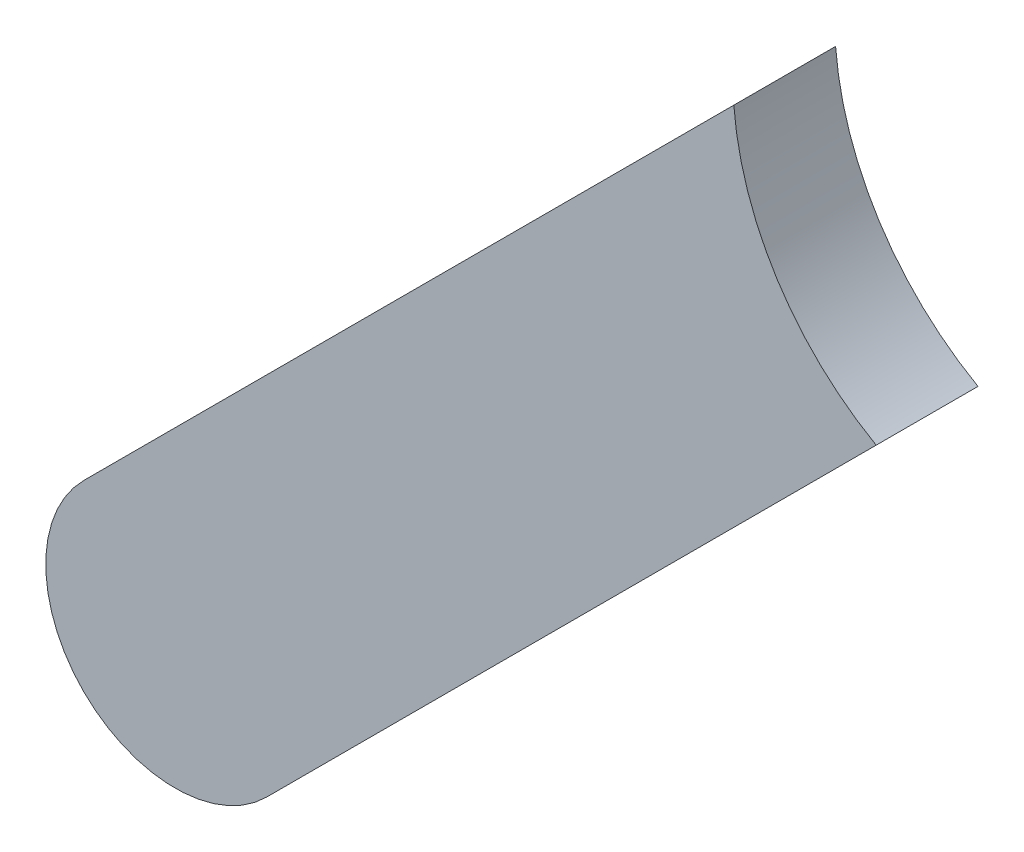
ISO-10303-21;
HEADER;
FILE_DESCRIPTION(('STEP AP214'),'2;1');
FILE_NAME('part.step','',(''),(''),'','','');
FILE_SCHEMA(('AUTOMOTIVE_DESIGN { 1 0 10303 214 1 1 1 1 }'));
ENDSEC;
DATA;
#1=APPLICATION_CONTEXT('core data for automotive mechanical design processes');
#2=APPLICATION_PROTOCOL_DEFINITION('international standard','automotive_design',2000,#1);
#3=PRODUCT_CONTEXT('',#1,'mechanical');
#4=PRODUCT('Part','Part','',(#3));
#5=PRODUCT_RELATED_PRODUCT_CATEGORY('part','',(#4));
#6=PRODUCT_DEFINITION_FORMATION('','',#4);
#7=PRODUCT_DEFINITION_CONTEXT('part definition',#1,'design');
#8=PRODUCT_DEFINITION('design','',#6,#7);
#9=PRODUCT_DEFINITION_SHAPE('','',#8);
#10=(LENGTH_UNIT() NAMED_UNIT(*) SI_UNIT(.MILLI.,.METRE.));
#11=(NAMED_UNIT(*) PLANE_ANGLE_UNIT() SI_UNIT($,.RADIAN.));
#12=(NAMED_UNIT(*) SI_UNIT($,.STERADIAN.) SOLID_ANGLE_UNIT());
#13=UNCERTAINTY_MEASURE_WITH_UNIT(LENGTH_MEASURE(1.E-05),#10,'distance_accuracy_value','');
#14=(GEOMETRIC_REPRESENTATION_CONTEXT(3) GLOBAL_UNCERTAINTY_ASSIGNED_CONTEXT((#13)) GLOBAL_UNIT_ASSIGNED_CONTEXT((#10,
#11,#12)) REPRESENTATION_CONTEXT('',''));
#15=CARTESIAN_POINT('',(0.,0.,0.));
#16=DIRECTION('',(0.,0.,1.));
#17=DIRECTION('',(1.,0.,0.));
#18=AXIS2_PLACEMENT_3D('',#15,#16,#17);
#19=CARTESIAN_POINT('',(147.4996034,71.46810446,0.));
#20=DIRECTION('',(-0.707106781186551,0.707106781186544,0.));
#21=DIRECTION('',(0.707106781186544,0.707106781186551,0.));
#22=AXIS2_PLACEMENT_3D('',#19,#20,#21);
#23=PLANE('',#22);
#24=DIRECTION('',(0.707106781186544,0.707106781186551,0.));
#25=VECTOR('',#24,1.);
#26=CARTESIAN_POINT('',(147.4996034,71.46810446,0.1999996));
#27=LINE('',#26,#25);
#28=CARTESIAN_POINT('',(147.4996034,71.46810446,0.1999996));
#29=VERTEX_POINT('',#28);
#30=CARTESIAN_POINT('',(148.697544783277,72.6660458432771,0.1999996));
#31=VERTEX_POINT('',#30);
#32=EDGE_CURVE('E11',#29,#31,#27,.T.);
#33=ORIENTED_EDGE('',*,*,#32,.F.);
#34=DIRECTION('',(0.,0.,1.));
#35=VECTOR('',#34,1.);
#36=CARTESIAN_POINT('',(147.4996034,71.46810446,0.));
#37=LINE('',#36,#35);
#38=CARTESIAN_POINT('',(147.4996034,71.46810446,0.));
#39=VERTEX_POINT('',#38);
#40=EDGE_CURVE('E24',#39,#29,#37,.T.);
#41=ORIENTED_EDGE('',*,*,#40,.F.);
#42=DIRECTION('',(0.707106781186544,0.707106781186551,0.));
#43=VECTOR('',#42,1.);
#44=CARTESIAN_POINT('',(147.4996034,71.46810446,0.));
#45=LINE('',#44,#43);
#46=CARTESIAN_POINT('',(148.697544783277,72.6660458432771,0.));
#47=VERTEX_POINT('',#46);
#48=EDGE_CURVE('E75',#39,#47,#45,.T.);
#49=ORIENTED_EDGE('',*,*,#48,.T.);
#50=DIRECTION('',(0.,0.,1.));
#51=VECTOR('',#50,1.);
#52=CARTESIAN_POINT('',(148.697544783277,72.6660458432771,0.));
#53=LINE('',#52,#51);
#54=EDGE_CURVE('E37',#47,#31,#53,.T.);
#55=ORIENTED_EDGE('',*,*,#54,.T.);
#56=EDGE_LOOP('',(#33,#41,#49,#55));
#57=FACE_BOUND('',#56,.T.);
#58=ADVANCED_FACE('F17',(#57),#23,.F.);
#59=CARTESIAN_POINT('',(148.971,73.1490028,0.));
#60=DIRECTION('',(0.,0.,-1.));
#61=DIRECTION('',(1.,0.,0.));
#62=AXIS2_PLACEMENT_3D('',#59,#60,#61);
#63=CYLINDRICAL_SURFACE('',#62,0.55500016);
#64=DIRECTION('',(0.,0.,1.));
#65=VECTOR('',#64,1.);
#66=CARTESIAN_POINT('',(148.417771592012,73.1046913320121,0.));
#67=LINE('',#66,#65);
#68=CARTESIAN_POINT('',(148.417771592012,73.1046913320121,0.));
#69=VERTEX_POINT('',#68);
#70=CARTESIAN_POINT('',(148.417771592012,73.1046913320121,0.1999996));
#71=VERTEX_POINT('',#70);
#72=EDGE_CURVE('E67',#69,#71,#67,.T.);
#73=ORIENTED_EDGE('',*,*,#72,.T.);
#74=CARTESIAN_POINT('',(148.971,73.1490028,0.1999996));
#75=DIRECTION('',(0.,0.,1.));
#76=DIRECTION('',(1.,0.,0.));
#77=AXIS2_PLACEMENT_3D('',#74,#75,#76);
#78=CIRCLE('',#77,0.55500016);
#79=EDGE_CURVE('E82',#71,#31,#78,.T.);
#80=ORIENTED_EDGE('',*,*,#79,.T.);
#81=ORIENTED_EDGE('',*,*,#54,.F.);
#82=CARTESIAN_POINT('',(148.971,73.1490028,0.));
#83=DIRECTION('',(0.,0.,1.));
#84=DIRECTION('',(1.,0.,0.));
#85=AXIS2_PLACEMENT_3D('',#82,#83,#84);
#86=CIRCLE('',#85,0.55500016);
#87=EDGE_CURVE('E80',#69,#47,#86,.T.);
#88=ORIENTED_EDGE('',*,*,#87,.F.);
#89=EDGE_LOOP('',(#73,#80,#81,#88));
#90=FACE_BOUND('',#89,.T.);
#91=ADVANCED_FACE('F88',(#90),#63,.F.);
#92=CARTESIAN_POINT('',(148.417771592012,73.1046913320121,0.));
#93=DIRECTION('',(0.707106781186544,-0.707106781186551,0.));
#94=DIRECTION('',(-0.707106781186551,-0.707106781186544,0.));
#95=AXIS2_PLACEMENT_3D('',#92,#93,#94);
#96=PLANE('',#95);
#97=DIRECTION('',(-0.707106781186551,-0.707106781186544,0.));
#98=VECTOR('',#97,1.);
#99=CARTESIAN_POINT('',(148.641689,73.32860874,0.1999996));
#100=LINE('',#99,#98);
#101=CARTESIAN_POINT('',(147.14039406,71.8273138,0.1999996));
#102=VERTEX_POINT('',#101);
#103=EDGE_CURVE('E71',#71,#102,#100,.T.);
#104=ORIENTED_EDGE('',*,*,#103,.F.);
#105=ORIENTED_EDGE('',*,*,#72,.F.);
#106=DIRECTION('',(-0.707106781186551,-0.707106781186544,0.));
#107=VECTOR('',#106,1.);
#108=CARTESIAN_POINT('',(148.641689,73.32860874,0.));
#109=LINE('',#108,#107);
#110=CARTESIAN_POINT('',(147.14039406,71.8273138,0.));
#111=VERTEX_POINT('',#110);
#112=EDGE_CURVE('E63',#69,#111,#109,.T.);
#113=ORIENTED_EDGE('',*,*,#112,.T.);
#114=DIRECTION('',(0.,0.,1.));
#115=VECTOR('',#114,1.);
#116=CARTESIAN_POINT('',(147.14039406,71.8273138,0.));
#117=LINE('',#116,#115);
#118=EDGE_CURVE('E53',#111,#102,#117,.T.);
#119=ORIENTED_EDGE('',*,*,#118,.T.);
#120=EDGE_LOOP('',(#104,#105,#113,#119));
#121=FACE_BOUND('',#120,.T.);
#122=ADVANCED_FACE('F66',(#121),#96,.F.);
#123=CARTESIAN_POINT('',(147.31999873,71.64770913,0.));
#124=DIRECTION('',(0.,0.,-1.));
#125=DIRECTION('',(-0.707106781186632,0.707106781186464,0.));
#126=AXIS2_PLACEMENT_3D('',#123,#124,#125);
#127=CYLINDRICAL_SURFACE('',#126,0.253999360179559);
#128=CARTESIAN_POINT('',(147.31999873,71.64770913,0.1999996));
#129=DIRECTION('',(0.,0.,1.));
#130=DIRECTION('',(-0.707106781186632,0.707106781186464,0.));
#131=AXIS2_PLACEMENT_3D('',#128,#129,#130);
#132=CIRCLE('',#131,0.253999360179559);
#133=EDGE_CURVE('E59',#102,#29,#132,.T.);
#134=ORIENTED_EDGE('',*,*,#133,.F.);
#135=ORIENTED_EDGE('',*,*,#118,.F.);
#136=CARTESIAN_POINT('',(147.31999873,71.64770913,0.));
#137=DIRECTION('',(0.,0.,1.));
#138=DIRECTION('',(-0.707106781186632,0.707106781186464,0.));
#139=AXIS2_PLACEMENT_3D('',#136,#137,#138);
#140=CIRCLE('',#139,0.253999360179559);
#141=EDGE_CURVE('E57',#111,#39,#140,.T.);
#142=ORIENTED_EDGE('',*,*,#141,.T.);
#143=ORIENTED_EDGE('',*,*,#40,.T.);
#144=EDGE_LOOP('',(#134,#135,#142,#143));
#145=FACE_BOUND('',#144,.T.);
#146=ADVANCED_FACE('F55',(#145),#127,.T.);
#147=CARTESIAN_POINT('',(147.4996034,71.46810446,0.));
#148=DIRECTION('',(0.,0.,-1.));
#149=DIRECTION('',(-1.,0.,0.));
#150=AXIS2_PLACEMENT_3D('',#147,#148,#149);
#151=PLANE('',#150);
#152=ORIENTED_EDGE('',*,*,#48,.F.);
#153=ORIENTED_EDGE('',*,*,#141,.F.);
#154=ORIENTED_EDGE('',*,*,#112,.F.);
#155=ORIENTED_EDGE('',*,*,#87,.T.);
#156=EDGE_LOOP('',(#152,#153,#154,#155));
#157=FACE_BOUND('',#156,.T.);
#158=ADVANCED_FACE('F74',(#157),#151,.T.);
#159=CARTESIAN_POINT('',(147.4996034,71.46810446,0.1999996));
#160=DIRECTION('',(0.,0.,-1.));
#161=DIRECTION('',(-1.,0.,0.));
#162=AXIS2_PLACEMENT_3D('',#159,#160,#161);
#163=PLANE('',#162);
#164=ORIENTED_EDGE('',*,*,#133,.T.);
#165=ORIENTED_EDGE('',*,*,#32,.T.);
#166=ORIENTED_EDGE('',*,*,#79,.F.);
#167=ORIENTED_EDGE('',*,*,#103,.T.);
#168=EDGE_LOOP('',(#164,#165,#166,#167));
#169=FACE_BOUND('',#168,.T.);
#170=ADVANCED_FACE('F91',(#169),#163,.F.);
#171=CLOSED_SHELL('',(#58,#91,#122,#146,#158,#170));
#172=MANIFOLD_SOLID_BREP('B1',#171);
#173=ADVANCED_BREP_SHAPE_REPRESENTATION('',(#18,#172),#14);
#174=SHAPE_DEFINITION_REPRESENTATION(#9,#173);
ENDSEC;
END-ISO-10303-21;
